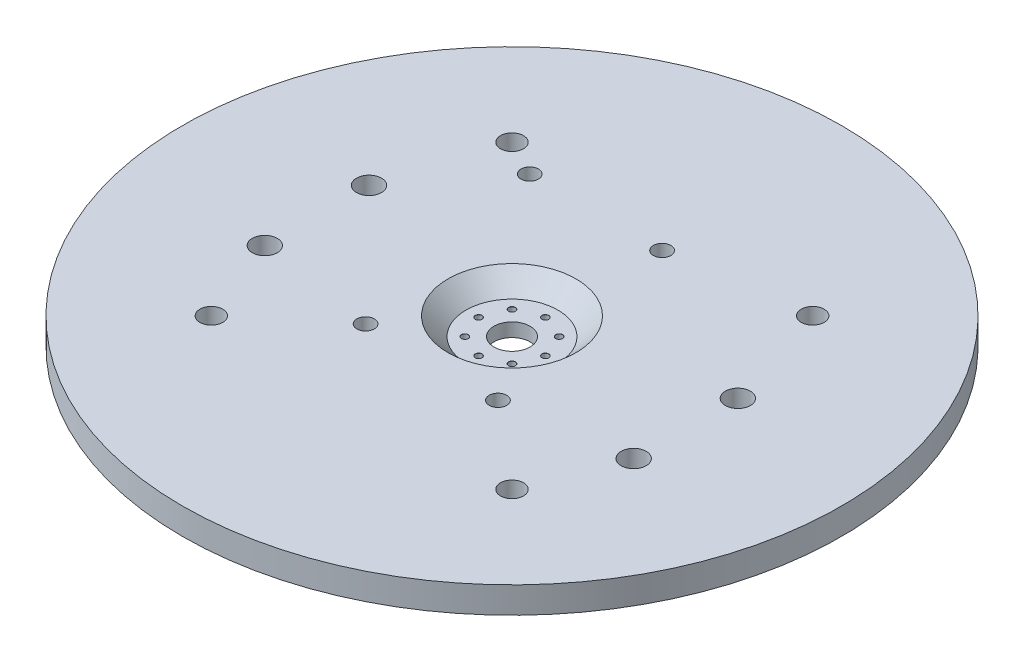
ISO-10303-21;
HEADER;
FILE_DESCRIPTION(('STEP AP214'),'2;1');
FILE_NAME('part.step','',(''),(''),'','','');
FILE_SCHEMA(('AUTOMOTIVE_DESIGN { 1 0 10303 214 1 1 1 1 }'));
ENDSEC;
DATA;
#1=APPLICATION_CONTEXT('core data for automotive mechanical design processes');
#2=APPLICATION_PROTOCOL_DEFINITION('international standard','automotive_design',2000,#1);
#3=PRODUCT_CONTEXT('',#1,'mechanical');
#4=PRODUCT('Part','Part','',(#3));
#5=PRODUCT_RELATED_PRODUCT_CATEGORY('part','',(#4));
#6=PRODUCT_DEFINITION_FORMATION('','',#4);
#7=PRODUCT_DEFINITION_CONTEXT('part definition',#1,'design');
#8=PRODUCT_DEFINITION('design','',#6,#7);
#9=PRODUCT_DEFINITION_SHAPE('','',#8);
#10=(LENGTH_UNIT() NAMED_UNIT(*) SI_UNIT(.MILLI.,.METRE.));
#11=(NAMED_UNIT(*) PLANE_ANGLE_UNIT() SI_UNIT($,.RADIAN.));
#12=(NAMED_UNIT(*) SI_UNIT($,.STERADIAN.) SOLID_ANGLE_UNIT());
#13=UNCERTAINTY_MEASURE_WITH_UNIT(LENGTH_MEASURE(1.E-05),#10,'distance_accuracy_value','');
#14=(GEOMETRIC_REPRESENTATION_CONTEXT(3) GLOBAL_UNCERTAINTY_ASSIGNED_CONTEXT((#13)) GLOBAL_UNIT_ASSIGNED_CONTEXT((#10,
#11,#12)) REPRESENTATION_CONTEXT('',''));
#15=CARTESIAN_POINT('',(0.,0.,0.));
#16=DIRECTION('',(0.,0.,1.));
#17=DIRECTION('',(1.,0.,0.));
#18=AXIS2_PLACEMENT_3D('',#15,#16,#17);
#19=CARTESIAN_POINT('',(0.,-3.1623,0.));
#20=DIRECTION('',(0.,1.,0.));
#21=DIRECTION('',(0.,0.,1.));
#22=AXIS2_PLACEMENT_3D('',#19,#20,#21);
#23=PLANE('',#22);
#24=CARTESIAN_POINT('',(0.,-3.1623,0.));
#25=DIRECTION('',(0.,1.,0.));
#26=DIRECTION('',(0.,0.,1.));
#27=AXIS2_PLACEMENT_3D('',#24,#25,#26);
#28=CIRCLE('',#27,79.0575);
#29=CARTESIAN_POINT('',(0.,-3.1623,79.0575));
#30=VERTEX_POINT('',#29);
#31=EDGE_CURVE('E60',#30,#30,#28,.T.);
#32=ORIENTED_EDGE('',*,*,#31,.F.);
#33=EDGE_LOOP('',(#32));
#34=FACE_BOUND('',#33,.T.);
#35=CARTESIAN_POINT('',(15.875,-3.1623,19.2459107281112));
#36=DIRECTION('',(0.,1.,0.));
#37=DIRECTION('',(0.,0.,1.));
#38=AXIS2_PLACEMENT_3D('',#35,#36,#37);
#39=CIRCLE('',#38,2.1);
#40=CARTESIAN_POINT('',(15.875,-3.1623,21.3459107281112));
#41=VERTEX_POINT('',#40);
#42=EDGE_CURVE('E63',#41,#41,#39,.T.);
#43=ORIENTED_EDGE('',*,*,#42,.T.);
#44=EDGE_LOOP('',(#43));
#45=FACE_BOUND('',#44,.T.);
#46=CARTESIAN_POINT('',(-15.875,-3.1623,19.2459107281112));
#47=DIRECTION('',(0.,1.,0.));
#48=DIRECTION('',(0.,0.,1.));
#49=AXIS2_PLACEMENT_3D('',#46,#47,#48);
#50=CIRCLE('',#49,2.1);
#51=CARTESIAN_POINT('',(-15.875,-3.1623,21.3459107281112));
#52=VERTEX_POINT('',#51);
#53=EDGE_CURVE('E71',#52,#52,#50,.T.);
#54=ORIENTED_EDGE('',*,*,#53,.T.);
#55=EDGE_LOOP('',(#54));
#56=FACE_BOUND('',#55,.T.);
#57=CARTESIAN_POINT('',(4.4311914,-3.1623,-31.5711836718892));
#58=DIRECTION('',(0.,1.,0.));
#59=DIRECTION('',(0.,0.,1.));
#60=AXIS2_PLACEMENT_3D('',#57,#58,#59);
#61=CIRCLE('',#60,2.1);
#62=CARTESIAN_POINT('',(4.4311914,-3.1623,-29.4711836718892));
#63=VERTEX_POINT('',#62);
#64=EDGE_CURVE('E77',#63,#63,#61,.T.);
#65=ORIENTED_EDGE('',*,*,#64,.T.);
#66=EDGE_LOOP('',(#65));
#67=FACE_BOUND('',#66,.T.);
#68=CARTESIAN_POINT('',(-27.3188086,-3.1623,-31.5711836718892));
#69=DIRECTION('',(0.,1.,0.));
#70=DIRECTION('',(0.,0.,1.));
#71=AXIS2_PLACEMENT_3D('',#68,#69,#70);
#72=CIRCLE('',#71,2.1);
#73=CARTESIAN_POINT('',(-27.3188086,-3.1623,-29.4711836718892));
#74=VERTEX_POINT('',#73);
#75=EDGE_CURVE('E83',#74,#74,#72,.T.);
#76=ORIENTED_EDGE('',*,*,#75,.T.);
#77=EDGE_LOOP('',(#76));
#78=FACE_BOUND('',#77,.T.);
#79=CARTESIAN_POINT('',(44.245,-3.1623,15.0584163281112));
#80=DIRECTION('',(0.,1.,0.));
#81=DIRECTION('',(0.,0.,1.));
#82=AXIS2_PLACEMENT_3D('',#79,#80,#81);
#83=CIRCLE('',#82,3.);
#84=CARTESIAN_POINT('',(44.245,-3.1623,18.0584163281112));
#85=VERTEX_POINT('',#84);
#86=EDGE_CURVE('E89',#85,#85,#83,.T.);
#87=ORIENTED_EDGE('',*,*,#86,.T.);
#88=EDGE_LOOP('',(#87));
#89=FACE_BOUND('',#88,.T.);
#90=CARTESIAN_POINT('',(44.245,-3.1623,-9.94158367188884));
#91=DIRECTION('',(0.,1.,0.));
#92=DIRECTION('',(0.,0.,1.));
#93=AXIS2_PLACEMENT_3D('',#90,#91,#92);
#94=CIRCLE('',#93,3.);
#95=CARTESIAN_POINT('',(44.245,-3.1623,-6.94158367188884));
#96=VERTEX_POINT('',#95);
#97=EDGE_CURVE('E95',#96,#96,#94,.T.);
#98=ORIENTED_EDGE('',*,*,#97,.T.);
#99=EDGE_LOOP('',(#98));
#100=FACE_BOUND('',#99,.T.);
#101=CARTESIAN_POINT('',(-44.245,-3.1623,15.0584163281112));
#102=DIRECTION('',(0.,1.,0.));
#103=DIRECTION('',(0.,0.,1.));
#104=AXIS2_PLACEMENT_3D('',#101,#102,#103);
#105=CIRCLE('',#104,3.);
#106=CARTESIAN_POINT('',(-44.245,-3.1623,18.0584163281112));
#107=VERTEX_POINT('',#106);
#108=EDGE_CURVE('E101',#107,#107,#105,.T.);
#109=ORIENTED_EDGE('',*,*,#108,.T.);
#110=EDGE_LOOP('',(#109));
#111=FACE_BOUND('',#110,.T.);
#112=CARTESIAN_POINT('',(-44.245,-3.1623,-9.94158367188883));
#113=DIRECTION('',(0.,1.,0.));
#114=DIRECTION('',(0.,0.,1.));
#115=AXIS2_PLACEMENT_3D('',#112,#113,#114);
#116=CIRCLE('',#115,3.);
#117=CARTESIAN_POINT('',(-44.245,-3.1623,-6.94158367188883));
#118=VERTEX_POINT('',#117);
#119=EDGE_CURVE('E107',#118,#118,#116,.T.);
#120=ORIENTED_EDGE('',*,*,#119,.T.);
#121=EDGE_LOOP('',(#120));
#122=FACE_BOUND('',#121,.T.);
#123=CARTESIAN_POINT('',(36.0624458405139,-3.1623,-36.0624458405139));
#124=DIRECTION('',(0.,1.,0.));
#125=DIRECTION('',(0.,0.,1.));
#126=AXIS2_PLACEMENT_3D('',#123,#124,#125);
#127=CIRCLE('',#126,2.75);
#128=CARTESIAN_POINT('',(36.0624458405139,-3.1623,-33.3124458405139));
#129=VERTEX_POINT('',#128);
#130=EDGE_CURVE('E113',#129,#129,#127,.T.);
#131=ORIENTED_EDGE('',*,*,#130,.T.);
#132=EDGE_LOOP('',(#131));
#133=FACE_BOUND('',#132,.T.);
#134=CARTESIAN_POINT('',(36.0624458405139,-3.1623,36.0624458405139));
#135=DIRECTION('',(0.,1.,0.));
#136=DIRECTION('',(0.,0.,1.));
#137=AXIS2_PLACEMENT_3D('',#134,#135,#136);
#138=CIRCLE('',#137,2.75);
#139=CARTESIAN_POINT('',(36.0624458405139,-3.1623,38.8124458405139));
#140=VERTEX_POINT('',#139);
#141=EDGE_CURVE('E119',#140,#140,#138,.T.);
#142=ORIENTED_EDGE('',*,*,#141,.T.);
#143=EDGE_LOOP('',(#142));
#144=FACE_BOUND('',#143,.T.);
#145=CARTESIAN_POINT('',(-36.0624458405139,-3.1623,36.0624458405139));
#146=DIRECTION('',(0.,1.,0.));
#147=DIRECTION('',(0.,0.,1.));
#148=AXIS2_PLACEMENT_3D('',#145,#146,#147);
#149=CIRCLE('',#148,2.75);
#150=CARTESIAN_POINT('',(-36.0624458405139,-3.1623,38.8124458405139));
#151=VERTEX_POINT('',#150);
#152=EDGE_CURVE('E125',#151,#151,#149,.T.);
#153=ORIENTED_EDGE('',*,*,#152,.T.);
#154=EDGE_LOOP('',(#153));
#155=FACE_BOUND('',#154,.T.);
#156=CARTESIAN_POINT('',(-36.0624458405139,-3.1623,-36.0624458405139));
#157=DIRECTION('',(0.,1.,0.));
#158=DIRECTION('',(0.,0.,1.));
#159=AXIS2_PLACEMENT_3D('',#156,#157,#158);
#160=CIRCLE('',#159,2.75);
#161=CARTESIAN_POINT('',(-36.0624458405139,-3.1623,-33.3124458405139));
#162=VERTEX_POINT('',#161);
#163=EDGE_CURVE('E131',#162,#162,#160,.T.);
#164=ORIENTED_EDGE('',*,*,#163,.T.);
#165=EDGE_LOOP('',(#164));
#166=FACE_BOUND('',#165,.T.);
#167=CARTESIAN_POINT('',(0.,-3.1623,0.));
#168=DIRECTION('',(0.,1.,0.));
#169=DIRECTION('',(0.,0.,1.));
#170=AXIS2_PLACEMENT_3D('',#167,#168,#169);
#171=CIRCLE('',#170,11.);
#172=CARTESIAN_POINT('',(0.,-3.1623,11.));
#173=VERTEX_POINT('',#172);
#174=EDGE_CURVE('E11',#173,#173,#171,.F.);
#175=ORIENTED_EDGE('',*,*,#174,.F.);
#176=EDGE_LOOP('',(#175));
#177=FACE_BOUND('',#176,.T.);
#178=ADVANCED_FACE('F41',(#34,#45,#56,#67,#78,#89,#100,#111,#122,#133,#144,#155,#166,#177),#23,.F.);
#179=CARTESIAN_POINT('',(0.,-3.1623,0.));
#180=DIRECTION('',(0.,1.,0.));
#181=DIRECTION('',(0.,0.,1.));
#182=AXIS2_PLACEMENT_3D('',#179,#180,#181);
#183=CYLINDRICAL_SURFACE('',#182,4.330200001);
#184=CARTESIAN_POINT('',(0.,-1.1623,0.));
#185=DIRECTION('',(0.,1.,0.));
#186=DIRECTION('',(0.,0.,1.));
#187=AXIS2_PLACEMENT_3D('',#184,#185,#186);
#188=CIRCLE('',#187,4.330200001);
#189=CARTESIAN_POINT('',(0.,-1.1623,4.330200001));
#190=VERTEX_POINT('',#189);
#191=EDGE_CURVE('E137',#190,#190,#188,.F.);
#192=ORIENTED_EDGE('',*,*,#191,.F.);
#193=EDGE_LOOP('',(#192));
#194=FACE_BOUND('',#193,.T.);
#195=CARTESIAN_POINT('',(0.,-4.4323,0.));
#196=DIRECTION('',(0.,-1.,0.));
#197=DIRECTION('',(0.,0.,-1.));
#198=AXIS2_PLACEMENT_3D('',#195,#196,#197);
#199=CIRCLE('',#198,4.330200001);
#200=CARTESIAN_POINT('',(0.,-4.4323,-4.330200001));
#201=VERTEX_POINT('',#200);
#202=EDGE_CURVE('E215',#201,#201,#199,.T.);
#203=ORIENTED_EDGE('',*,*,#202,.T.);
#204=EDGE_LOOP('',(#203));
#205=FACE_BOUND('',#204,.T.);
#206=ADVANCED_FACE('F219',(#194,#205),#183,.F.);
#207=CARTESIAN_POINT('',(0.,3.1623,0.));
#208=DIRECTION('',(0.,-1.,0.));
#209=DIRECTION('',(0.,0.,-1.));
#210=AXIS2_PLACEMENT_3D('',#207,#208,#209);
#211=CYLINDRICAL_SURFACE('',#210,79.0575);
#212=CARTESIAN_POINT('',(0.,3.1623,0.));
#213=DIRECTION('',(0.,1.,0.));
#214=DIRECTION('',(0.,0.,1.));
#215=AXIS2_PLACEMENT_3D('',#212,#213,#214);
#216=CIRCLE('',#215,79.0575);
#217=CARTESIAN_POINT('',(0.,3.1623,79.0575));
#218=VERTEX_POINT('',#217);
#219=EDGE_CURVE('E57',#218,#218,#216,.T.);
#220=ORIENTED_EDGE('',*,*,#219,.F.);
#221=EDGE_LOOP('',(#220));
#222=FACE_BOUND('',#221,.T.);
#223=ORIENTED_EDGE('',*,*,#31,.T.);
#224=EDGE_LOOP('',(#223));
#225=FACE_BOUND('',#224,.T.);
#226=ADVANCED_FACE('F244',(#222,#225),#211,.T.);
#227=CARTESIAN_POINT('',(0.,3.1623,0.));
#228=DIRECTION('',(0.,1.,0.));
#229=DIRECTION('',(0.,0.,1.));
#230=AXIS2_PLACEMENT_3D('',#227,#228,#229);
#231=PLANE('',#230);
#232=CARTESIAN_POINT('',(0.,3.1623,0.));
#233=DIRECTION('',(0.,1.,0.));
#234=DIRECTION('',(0.,0.,1.));
#235=AXIS2_PLACEMENT_3D('',#232,#233,#234);
#236=CIRCLE('',#235,15.35);
#237=CARTESIAN_POINT('',(0.,3.1623,15.35));
#238=VERTEX_POINT('',#237);
#239=EDGE_CURVE('E53',#238,#238,#236,.F.);
#240=ORIENTED_EDGE('',*,*,#239,.T.);
#241=EDGE_LOOP('',(#240));
#242=FACE_BOUND('',#241,.T.);
#243=CARTESIAN_POINT('',(-36.0624458405139,3.1623,-36.0624458405139));
#244=DIRECTION('',(0.,1.,0.));
#245=DIRECTION('',(0.,0.,1.));
#246=AXIS2_PLACEMENT_3D('',#243,#244,#245);
#247=CIRCLE('',#246,2.75);
#248=CARTESIAN_POINT('',(-36.0624458405139,3.1623,-33.3124458405139));
#249=VERTEX_POINT('',#248);
#250=EDGE_CURVE('E134',#249,#249,#247,.T.);
#251=ORIENTED_EDGE('',*,*,#250,.F.);
#252=EDGE_LOOP('',(#251));
#253=FACE_BOUND('',#252,.T.);
#254=CARTESIAN_POINT('',(-36.0624458405139,3.1623,36.0624458405139));
#255=DIRECTION('',(0.,1.,0.));
#256=DIRECTION('',(0.,0.,1.));
#257=AXIS2_PLACEMENT_3D('',#254,#255,#256);
#258=CIRCLE('',#257,2.75);
#259=CARTESIAN_POINT('',(-36.0624458405139,3.1623,38.8124458405139));
#260=VERTEX_POINT('',#259);
#261=EDGE_CURVE('E128',#260,#260,#258,.T.);
#262=ORIENTED_EDGE('',*,*,#261,.F.);
#263=EDGE_LOOP('',(#262));
#264=FACE_BOUND('',#263,.T.);
#265=CARTESIAN_POINT('',(36.0624458405139,3.1623,36.0624458405139));
#266=DIRECTION('',(0.,1.,0.));
#267=DIRECTION('',(0.,0.,1.));
#268=AXIS2_PLACEMENT_3D('',#265,#266,#267);
#269=CIRCLE('',#268,2.75);
#270=CARTESIAN_POINT('',(36.0624458405139,3.1623,38.8124458405139));
#271=VERTEX_POINT('',#270);
#272=EDGE_CURVE('E122',#271,#271,#269,.T.);
#273=ORIENTED_EDGE('',*,*,#272,.F.);
#274=EDGE_LOOP('',(#273));
#275=FACE_BOUND('',#274,.T.);
#276=CARTESIAN_POINT('',(36.0624458405139,3.1623,-36.0624458405139));
#277=DIRECTION('',(0.,1.,0.));
#278=DIRECTION('',(0.,0.,1.));
#279=AXIS2_PLACEMENT_3D('',#276,#277,#278);
#280=CIRCLE('',#279,2.75);
#281=CARTESIAN_POINT('',(36.0624458405139,3.1623,-33.3124458405139));
#282=VERTEX_POINT('',#281);
#283=EDGE_CURVE('E116',#282,#282,#280,.T.);
#284=ORIENTED_EDGE('',*,*,#283,.F.);
#285=EDGE_LOOP('',(#284));
#286=FACE_BOUND('',#285,.T.);
#287=CARTESIAN_POINT('',(-44.245,3.1623,-9.94158367188883));
#288=DIRECTION('',(0.,1.,0.));
#289=DIRECTION('',(0.,0.,1.));
#290=AXIS2_PLACEMENT_3D('',#287,#288,#289);
#291=CIRCLE('',#290,3.);
#292=CARTESIAN_POINT('',(-44.245,3.1623,-6.94158367188882));
#293=VERTEX_POINT('',#292);
#294=EDGE_CURVE('E110',#293,#293,#291,.T.);
#295=ORIENTED_EDGE('',*,*,#294,.F.);
#296=EDGE_LOOP('',(#295));
#297=FACE_BOUND('',#296,.T.);
#298=CARTESIAN_POINT('',(-44.245,3.1623,15.0584163281112));
#299=DIRECTION('',(0.,1.,0.));
#300=DIRECTION('',(0.,0.,1.));
#301=AXIS2_PLACEMENT_3D('',#298,#299,#300);
#302=CIRCLE('',#301,3.);
#303=CARTESIAN_POINT('',(-44.245,3.1623,18.0584163281112));
#304=VERTEX_POINT('',#303);
#305=EDGE_CURVE('E104',#304,#304,#302,.T.);
#306=ORIENTED_EDGE('',*,*,#305,.F.);
#307=EDGE_LOOP('',(#306));
#308=FACE_BOUND('',#307,.T.);
#309=CARTESIAN_POINT('',(44.245,3.1623,-9.94158367188884));
#310=DIRECTION('',(0.,1.,0.));
#311=DIRECTION('',(0.,0.,1.));
#312=AXIS2_PLACEMENT_3D('',#309,#310,#311);
#313=CIRCLE('',#312,3.);
#314=CARTESIAN_POINT('',(44.245,3.1623,-6.94158367188883));
#315=VERTEX_POINT('',#314);
#316=EDGE_CURVE('E98',#315,#315,#313,.T.);
#317=ORIENTED_EDGE('',*,*,#316,.F.);
#318=EDGE_LOOP('',(#317));
#319=FACE_BOUND('',#318,.T.);
#320=CARTESIAN_POINT('',(44.245,3.1623,15.0584163281112));
#321=DIRECTION('',(0.,1.,0.));
#322=DIRECTION('',(0.,0.,1.));
#323=AXIS2_PLACEMENT_3D('',#320,#321,#322);
#324=CIRCLE('',#323,3.);
#325=CARTESIAN_POINT('',(44.245,3.1623,18.0584163281112));
#326=VERTEX_POINT('',#325);
#327=EDGE_CURVE('E92',#326,#326,#324,.T.);
#328=ORIENTED_EDGE('',*,*,#327,.F.);
#329=EDGE_LOOP('',(#328));
#330=FACE_BOUND('',#329,.T.);
#331=CARTESIAN_POINT('',(-27.3188086,3.1623,-31.5711836718892));
#332=DIRECTION('',(0.,1.,0.));
#333=DIRECTION('',(0.,0.,1.));
#334=AXIS2_PLACEMENT_3D('',#331,#332,#333);
#335=CIRCLE('',#334,2.1);
#336=CARTESIAN_POINT('',(-27.3188086,3.1623,-29.4711836718892));
#337=VERTEX_POINT('',#336);
#338=EDGE_CURVE('E86',#337,#337,#335,.T.);
#339=ORIENTED_EDGE('',*,*,#338,.F.);
#340=EDGE_LOOP('',(#339));
#341=FACE_BOUND('',#340,.T.);
#342=CARTESIAN_POINT('',(4.4311914,3.1623,-31.5711836718892));
#343=DIRECTION('',(0.,1.,0.));
#344=DIRECTION('',(0.,0.,1.));
#345=AXIS2_PLACEMENT_3D('',#342,#343,#344);
#346=CIRCLE('',#345,2.1);
#347=CARTESIAN_POINT('',(4.4311914,3.1623,-29.4711836718892));
#348=VERTEX_POINT('',#347);
#349=EDGE_CURVE('E80',#348,#348,#346,.T.);
#350=ORIENTED_EDGE('',*,*,#349,.F.);
#351=EDGE_LOOP('',(#350));
#352=FACE_BOUND('',#351,.T.);
#353=CARTESIAN_POINT('',(-15.875,3.1623,19.2459107281112));
#354=DIRECTION('',(0.,1.,0.));
#355=DIRECTION('',(0.,0.,1.));
#356=AXIS2_PLACEMENT_3D('',#353,#354,#355);
#357=CIRCLE('',#356,2.1);
#358=CARTESIAN_POINT('',(-15.875,3.1623,21.3459107281112));
#359=VERTEX_POINT('',#358);
#360=EDGE_CURVE('E74',#359,#359,#357,.T.);
#361=ORIENTED_EDGE('',*,*,#360,.F.);
#362=EDGE_LOOP('',(#361));
#363=FACE_BOUND('',#362,.T.);
#364=CARTESIAN_POINT('',(15.875,3.1623,19.2459107281112));
#365=DIRECTION('',(0.,1.,0.));
#366=DIRECTION('',(0.,0.,1.));
#367=AXIS2_PLACEMENT_3D('',#364,#365,#366);
#368=CIRCLE('',#367,2.1);
#369=CARTESIAN_POINT('',(15.875,3.1623,21.3459107281112));
#370=VERTEX_POINT('',#369);
#371=EDGE_CURVE('E68',#370,#370,#368,.T.);
#372=ORIENTED_EDGE('',*,*,#371,.F.);
#373=EDGE_LOOP('',(#372));
#374=FACE_BOUND('',#373,.T.);
#375=ORIENTED_EDGE('',*,*,#219,.T.);
#376=EDGE_LOOP('',(#375));
#377=FACE_BOUND('',#376,.T.);
#378=ADVANCED_FACE('F250',(#242,#253,#264,#275,#286,#297,#308,#319,#330,#341,#352,#363,#374,
#377),#231,.T.);
#379=CARTESIAN_POINT('',(15.875,3.1623,19.2459107281112));
#380=DIRECTION('',(0.,1.,0.));
#381=DIRECTION('',(0.,0.,1.));
#382=AXIS2_PLACEMENT_3D('',#379,#380,#381);
#383=CYLINDRICAL_SURFACE('',#382,2.1);
#384=ORIENTED_EDGE('',*,*,#42,.F.);
#385=EDGE_LOOP('',(#384));
#386=FACE_BOUND('',#385,.T.);
#387=ORIENTED_EDGE('',*,*,#371,.T.);
#388=EDGE_LOOP('',(#387));
#389=FACE_BOUND('',#388,.T.);
#390=ADVANCED_FACE('F257',(#386,#389),#383,.F.);
#391=CARTESIAN_POINT('',(-15.875,3.1623,19.2459107281112));
#392=DIRECTION('',(0.,1.,0.));
#393=DIRECTION('',(0.,0.,1.));
#394=AXIS2_PLACEMENT_3D('',#391,#392,#393);
#395=CYLINDRICAL_SURFACE('',#394,2.1);
#396=ORIENTED_EDGE('',*,*,#53,.F.);
#397=EDGE_LOOP('',(#396));
#398=FACE_BOUND('',#397,.T.);
#399=ORIENTED_EDGE('',*,*,#360,.T.);
#400=EDGE_LOOP('',(#399));
#401=FACE_BOUND('',#400,.T.);
#402=ADVANCED_FACE('F265',(#398,#401),#395,.F.);
#403=CARTESIAN_POINT('',(4.4311914,3.1623,-31.5711836718892));
#404=DIRECTION('',(0.,1.,0.));
#405=DIRECTION('',(0.,0.,1.));
#406=AXIS2_PLACEMENT_3D('',#403,#404,#405);
#407=CYLINDRICAL_SURFACE('',#406,2.1);
#408=ORIENTED_EDGE('',*,*,#64,.F.);
#409=EDGE_LOOP('',(#408));
#410=FACE_BOUND('',#409,.T.);
#411=ORIENTED_EDGE('',*,*,#349,.T.);
#412=EDGE_LOOP('',(#411));
#413=FACE_BOUND('',#412,.T.);
#414=ADVANCED_FACE('F295',(#410,#413),#407,.F.);
#415=CARTESIAN_POINT('',(-27.3188086,3.1623,-31.5711836718892));
#416=DIRECTION('',(0.,1.,0.));
#417=DIRECTION('',(0.,0.,1.));
#418=AXIS2_PLACEMENT_3D('',#415,#416,#417);
#419=CYLINDRICAL_SURFACE('',#418,2.1);
#420=ORIENTED_EDGE('',*,*,#75,.F.);
#421=EDGE_LOOP('',(#420));
#422=FACE_BOUND('',#421,.T.);
#423=ORIENTED_EDGE('',*,*,#338,.T.);
#424=EDGE_LOOP('',(#423));
#425=FACE_BOUND('',#424,.T.);
#426=ADVANCED_FACE('F301',(#422,#425),#419,.F.);
#427=CARTESIAN_POINT('',(44.245,3.1623,15.0584163281112));
#428=DIRECTION('',(0.,1.,0.));
#429=DIRECTION('',(0.,0.,1.));
#430=AXIS2_PLACEMENT_3D('',#427,#428,#429);
#431=CYLINDRICAL_SURFACE('',#430,3.);
#432=ORIENTED_EDGE('',*,*,#86,.F.);
#433=EDGE_LOOP('',(#432));
#434=FACE_BOUND('',#433,.T.);
#435=ORIENTED_EDGE('',*,*,#327,.T.);
#436=EDGE_LOOP('',(#435));
#437=FACE_BOUND('',#436,.T.);
#438=ADVANCED_FACE('F308',(#434,#437),#431,.F.);
#439=CARTESIAN_POINT('',(44.245,3.1623,-9.94158367188884));
#440=DIRECTION('',(0.,1.,0.));
#441=DIRECTION('',(0.,0.,1.));
#442=AXIS2_PLACEMENT_3D('',#439,#440,#441);
#443=CYLINDRICAL_SURFACE('',#442,3.);
#444=ORIENTED_EDGE('',*,*,#97,.F.);
#445=EDGE_LOOP('',(#444));
#446=FACE_BOUND('',#445,.T.);
#447=ORIENTED_EDGE('',*,*,#316,.T.);
#448=EDGE_LOOP('',(#447));
#449=FACE_BOUND('',#448,.T.);
#450=ADVANCED_FACE('F312',(#446,#449),#443,.F.);
#451=CARTESIAN_POINT('',(-44.245,3.1623,15.0584163281112));
#452=DIRECTION('',(0.,1.,0.));
#453=DIRECTION('',(0.,0.,1.));
#454=AXIS2_PLACEMENT_3D('',#451,#452,#453);
#455=CYLINDRICAL_SURFACE('',#454,3.);
#456=ORIENTED_EDGE('',*,*,#108,.F.);
#457=EDGE_LOOP('',(#456));
#458=FACE_BOUND('',#457,.T.);
#459=ORIENTED_EDGE('',*,*,#305,.T.);
#460=EDGE_LOOP('',(#459));
#461=FACE_BOUND('',#460,.T.);
#462=ADVANCED_FACE('F316',(#458,#461),#455,.F.);
#463=CARTESIAN_POINT('',(-44.245,3.1623,-9.94158367188883));
#464=DIRECTION('',(0.,1.,0.));
#465=DIRECTION('',(0.,0.,1.));
#466=AXIS2_PLACEMENT_3D('',#463,#464,#465);
#467=CYLINDRICAL_SURFACE('',#466,3.);
#468=ORIENTED_EDGE('',*,*,#119,.F.);
#469=EDGE_LOOP('',(#468));
#470=FACE_BOUND('',#469,.T.);
#471=ORIENTED_EDGE('',*,*,#294,.T.);
#472=EDGE_LOOP('',(#471));
#473=FACE_BOUND('',#472,.T.);
#474=ADVANCED_FACE('F320',(#470,#473),#467,.F.);
#475=CARTESIAN_POINT('',(36.0624458405139,3.1623,-36.0624458405139));
#476=DIRECTION('',(0.,1.,0.));
#477=DIRECTION('',(0.,0.,1.));
#478=AXIS2_PLACEMENT_3D('',#475,#476,#477);
#479=CYLINDRICAL_SURFACE('',#478,2.75);
#480=ORIENTED_EDGE('',*,*,#130,.F.);
#481=EDGE_LOOP('',(#480));
#482=FACE_BOUND('',#481,.T.);
#483=ORIENTED_EDGE('',*,*,#283,.T.);
#484=EDGE_LOOP('',(#483));
#485=FACE_BOUND('',#484,.T.);
#486=ADVANCED_FACE('F324',(#482,#485),#479,.F.);
#487=CARTESIAN_POINT('',(36.0624458405139,3.1623,36.0624458405139));
#488=DIRECTION('',(0.,1.,0.));
#489=DIRECTION('',(0.,0.,1.));
#490=AXIS2_PLACEMENT_3D('',#487,#488,#489);
#491=CYLINDRICAL_SURFACE('',#490,2.75);
#492=ORIENTED_EDGE('',*,*,#141,.F.);
#493=EDGE_LOOP('',(#492));
#494=FACE_BOUND('',#493,.T.);
#495=ORIENTED_EDGE('',*,*,#272,.T.);
#496=EDGE_LOOP('',(#495));
#497=FACE_BOUND('',#496,.T.);
#498=ADVANCED_FACE('F328',(#494,#497),#491,.F.);
#499=CARTESIAN_POINT('',(-36.0624458405139,3.1623,36.0624458405139));
#500=DIRECTION('',(0.,1.,0.));
#501=DIRECTION('',(0.,0.,1.));
#502=AXIS2_PLACEMENT_3D('',#499,#500,#501);
#503=CYLINDRICAL_SURFACE('',#502,2.75);
#504=ORIENTED_EDGE('',*,*,#152,.F.);
#505=EDGE_LOOP('',(#504));
#506=FACE_BOUND('',#505,.T.);
#507=ORIENTED_EDGE('',*,*,#261,.T.);
#508=EDGE_LOOP('',(#507));
#509=FACE_BOUND('',#508,.T.);
#510=ADVANCED_FACE('F332',(#506,#509),#503,.F.);
#511=CARTESIAN_POINT('',(-36.0624458405139,3.1623,-36.0624458405139));
#512=DIRECTION('',(0.,1.,0.));
#513=DIRECTION('',(0.,0.,1.));
#514=AXIS2_PLACEMENT_3D('',#511,#512,#513);
#515=CYLINDRICAL_SURFACE('',#514,2.75);
#516=ORIENTED_EDGE('',*,*,#163,.F.);
#517=EDGE_LOOP('',(#516));
#518=FACE_BOUND('',#517,.T.);
#519=ORIENTED_EDGE('',*,*,#250,.T.);
#520=EDGE_LOOP('',(#519));
#521=FACE_BOUND('',#520,.T.);
#522=ADVANCED_FACE('F336',(#518,#521),#515,.F.);
#523=CARTESIAN_POINT('',(0.,-1.1623,0.));
#524=DIRECTION('',(0.,1.,0.));
#525=DIRECTION('',(0.,0.,1.));
#526=AXIS2_PLACEMENT_3D('',#523,#524,#525);
#527=PLANE('',#526);
#528=CARTESIAN_POINT('',(-8.,-1.1623,0.));
#529=DIRECTION('',(0.,1.,0.));
#530=DIRECTION('',(0.,0.,1.));
#531=AXIS2_PLACEMENT_3D('',#528,#529,#530);
#532=CIRCLE('',#531,0.824999999999999);
#533=CARTESIAN_POINT('',(-8.,-1.1623,0.825000000000001));
#534=VERTEX_POINT('',#533);
#535=EDGE_CURVE('E185',#534,#534,#532,.T.);
#536=ORIENTED_EDGE('',*,*,#535,.F.);
#537=EDGE_LOOP('',(#536));
#538=FACE_BOUND('',#537,.T.);
#539=CARTESIAN_POINT('',(-5.65685424949238,-1.1623,-5.65685424949238));
#540=DIRECTION('',(0.,1.,0.));
#541=DIRECTION('',(0.,0.,1.));
#542=AXIS2_PLACEMENT_3D('',#539,#540,#541);
#543=CIRCLE('',#542,0.824999999999999);
#544=CARTESIAN_POINT('',(-5.65685424949238,-1.1623,-4.83185424949238));
#545=VERTEX_POINT('',#544);
#546=EDGE_CURVE('E179',#545,#545,#543,.T.);
#547=ORIENTED_EDGE('',*,*,#546,.F.);
#548=EDGE_LOOP('',(#547));
#549=FACE_BOUND('',#548,.T.);
#550=CARTESIAN_POINT('',(0.,-1.1623,-8.));
#551=DIRECTION('',(0.,1.,0.));
#552=DIRECTION('',(0.,0.,1.));
#553=AXIS2_PLACEMENT_3D('',#550,#551,#552);
#554=CIRCLE('',#553,0.824999999999999);
#555=CARTESIAN_POINT('',(0.,-1.1623,-7.175));
#556=VERTEX_POINT('',#555);
#557=EDGE_CURVE('E173',#556,#556,#554,.T.);
#558=ORIENTED_EDGE('',*,*,#557,.F.);
#559=EDGE_LOOP('',(#558));
#560=FACE_BOUND('',#559,.T.);
#561=CARTESIAN_POINT('',(5.65685424949238,-1.1623,-5.65685424949238));
#562=DIRECTION('',(0.,1.,0.));
#563=DIRECTION('',(0.,0.,1.));
#564=AXIS2_PLACEMENT_3D('',#561,#562,#563);
#565=CIRCLE('',#564,0.824999999999999);
#566=CARTESIAN_POINT('',(5.65685424949238,-1.1623,-4.83185424949238));
#567=VERTEX_POINT('',#566);
#568=EDGE_CURVE('E167',#567,#567,#565,.T.);
#569=ORIENTED_EDGE('',*,*,#568,.F.);
#570=EDGE_LOOP('',(#569));
#571=FACE_BOUND('',#570,.T.);
#572=CARTESIAN_POINT('',(8.,-1.1623,0.));
#573=DIRECTION('',(0.,1.,0.));
#574=DIRECTION('',(0.,0.,1.));
#575=AXIS2_PLACEMENT_3D('',#572,#573,#574);
#576=CIRCLE('',#575,0.824999999999999);
#577=CARTESIAN_POINT('',(8.,-1.1623,0.824999999999999));
#578=VERTEX_POINT('',#577);
#579=EDGE_CURVE('E161',#578,#578,#576,.T.);
#580=ORIENTED_EDGE('',*,*,#579,.F.);
#581=EDGE_LOOP('',(#580));
#582=FACE_BOUND('',#581,.T.);
#583=CARTESIAN_POINT('',(5.65685424949238,-1.1623,5.65685424949238));
#584=DIRECTION('',(0.,1.,0.));
#585=DIRECTION('',(0.,0.,1.));
#586=AXIS2_PLACEMENT_3D('',#583,#584,#585);
#587=CIRCLE('',#586,0.824999999999999);
#588=CARTESIAN_POINT('',(5.65685424949238,-1.1623,6.48185424949238));
#589=VERTEX_POINT('',#588);
#590=EDGE_CURVE('E155',#589,#589,#587,.T.);
#591=ORIENTED_EDGE('',*,*,#590,.F.);
#592=EDGE_LOOP('',(#591));
#593=FACE_BOUND('',#592,.T.);
#594=CARTESIAN_POINT('',(0.,-1.1623,8.));
#595=DIRECTION('',(0.,1.,0.));
#596=DIRECTION('',(0.,0.,1.));
#597=AXIS2_PLACEMENT_3D('',#594,#595,#596);
#598=CIRCLE('',#597,0.824999999999999);
#599=CARTESIAN_POINT('',(0.,-1.1623,8.825));
#600=VERTEX_POINT('',#599);
#601=EDGE_CURVE('E149',#600,#600,#598,.T.);
#602=ORIENTED_EDGE('',*,*,#601,.F.);
#603=EDGE_LOOP('',(#602));
#604=FACE_BOUND('',#603,.T.);
#605=CARTESIAN_POINT('',(-5.65685424949238,-1.1623,5.65685424949238));
#606=DIRECTION('',(0.,1.,0.));
#607=DIRECTION('',(0.,0.,1.));
#608=AXIS2_PLACEMENT_3D('',#605,#606,#607);
#609=CIRCLE('',#608,0.824999999999999);
#610=CARTESIAN_POINT('',(-5.65685424949238,-1.1623,6.48185424949238));
#611=VERTEX_POINT('',#610);
#612=EDGE_CURVE('E143',#611,#611,#609,.T.);
#613=ORIENTED_EDGE('',*,*,#612,.F.);
#614=EDGE_LOOP('',(#613));
#615=FACE_BOUND('',#614,.T.);
#616=CARTESIAN_POINT('',(0.,-1.1623,0.));
#617=DIRECTION('',(0.,1.,0.));
#618=DIRECTION('',(0.,0.,1.));
#619=AXIS2_PLACEMENT_3D('',#616,#617,#618);
#620=CIRCLE('',#619,11.0254000000001);
#621=CARTESIAN_POINT('',(0.,-1.1623,11.0254000000001));
#622=VERTEX_POINT('',#621);
#623=EDGE_CURVE('E49',#622,#622,#620,.T.);
#624=ORIENTED_EDGE('',*,*,#623,.T.);
#625=EDGE_LOOP('',(#624));
#626=FACE_BOUND('',#625,.T.);
#627=ORIENTED_EDGE('',*,*,#191,.T.);
#628=EDGE_LOOP('',(#627));
#629=FACE_BOUND('',#628,.T.);
#630=ADVANCED_FACE('F339',(#538,#549,#560,#571,#582,#593,#604,#615,#626,#629),#527,.T.);
#631=CARTESIAN_POINT('',(0.,-1.18770000000008,0.));
#632=DIRECTION('',(0.,1.,0.));
#633=DIRECTION('',(0.,0.,1.));
#634=AXIS2_PLACEMENT_3D('',#631,#632,#633);
#635=CONICAL_SURFACE('',#634,11.,0.785398163397443);
#636=ORIENTED_EDGE('',*,*,#239,.F.);
#637=EDGE_LOOP('',(#636));
#638=FACE_BOUND('',#637,.T.);
#639=ORIENTED_EDGE('',*,*,#623,.F.);
#640=EDGE_LOOP('',(#639));
#641=FACE_BOUND('',#640,.T.);
#642=ADVANCED_FACE('F44',(#638,#641),#635,.F.);
#643=CARTESIAN_POINT('',(-5.65685424949238,-1.1623,5.65685424949238));
#644=DIRECTION('',(0.,1.,0.));
#645=DIRECTION('',(0.,0.,1.));
#646=AXIS2_PLACEMENT_3D('',#643,#644,#645);
#647=CYLINDRICAL_SURFACE('',#646,0.799999999999997);
#648=CARTESIAN_POINT('',(-5.65685424949238,-1.1873,5.65685424949238));
#649=DIRECTION('',(0.,1.,0.));
#650=DIRECTION('',(0.,0.,1.));
#651=AXIS2_PLACEMENT_3D('',#648,#649,#650);
#652=CIRCLE('',#651,0.799999999999997);
#653=CARTESIAN_POINT('',(-5.65685424949238,-1.1873,6.45685424949238));
#654=VERTEX_POINT('',#653);
#655=EDGE_CURVE('E140',#654,#654,#652,.T.);
#656=ORIENTED_EDGE('',*,*,#655,.T.);
#657=EDGE_LOOP('',(#656));
#658=FACE_BOUND('',#657,.T.);
#659=CARTESIAN_POINT('',(-5.65685424949238,-4.4323,5.65685424949238));
#660=DIRECTION('',(0.,-1.,0.));
#661=DIRECTION('',(0.,0.,-1.));
#662=AXIS2_PLACEMENT_3D('',#659,#660,#661);
#663=CIRCLE('',#662,0.799999999999997);
#664=CARTESIAN_POINT('',(-5.65685424949238,-4.4323,4.85685424949238));
#665=VERTEX_POINT('',#664);
#666=EDGE_CURVE('E191',#665,#665,#663,.T.);
#667=ORIENTED_EDGE('',*,*,#666,.T.);
#668=EDGE_LOOP('',(#667));
#669=FACE_BOUND('',#668,.T.);
#670=ADVANCED_FACE('F345',(#658,#669),#647,.F.);
#671=CARTESIAN_POINT('',(-5.65685424949238,-1.1623,5.65685424949238));
#672=DIRECTION('',(0.,1.,0.));
#673=DIRECTION('',(0.,0.,1.));
#674=AXIS2_PLACEMENT_3D('',#671,#672,#673);
#675=CONICAL_SURFACE('',#674,0.824999999999999,0.785398163397518);
#676=ORIENTED_EDGE('',*,*,#655,.F.);
#677=EDGE_LOOP('',(#676));
#678=FACE_BOUND('',#677,.T.);
#679=ORIENTED_EDGE('',*,*,#612,.T.);
#680=EDGE_LOOP('',(#679));
#681=FACE_BOUND('',#680,.T.);
#682=ADVANCED_FACE('F348',(#678,#681),#675,.F.);
#683=CARTESIAN_POINT('',(0.,-1.1623,8.));
#684=DIRECTION('',(0.,1.,0.));
#685=DIRECTION('',(0.,0.,1.));
#686=AXIS2_PLACEMENT_3D('',#683,#684,#685);
#687=CYLINDRICAL_SURFACE('',#686,0.799999999999997);
#688=CARTESIAN_POINT('',(0.,-1.1873,8.));
#689=DIRECTION('',(0.,1.,0.));
#690=DIRECTION('',(0.,0.,1.));
#691=AXIS2_PLACEMENT_3D('',#688,#689,#690);
#692=CIRCLE('',#691,0.799999999999997);
#693=CARTESIAN_POINT('',(0.,-1.1873,8.8));
#694=VERTEX_POINT('',#693);
#695=EDGE_CURVE('E146',#694,#694,#692,.T.);
#696=ORIENTED_EDGE('',*,*,#695,.T.);
#697=EDGE_LOOP('',(#696));
#698=FACE_BOUND('',#697,.T.);
#699=CARTESIAN_POINT('',(0.,-4.4323,8.));
#700=DIRECTION('',(0.,-1.,0.));
#701=DIRECTION('',(0.,0.,-1.));
#702=AXIS2_PLACEMENT_3D('',#699,#700,#701);
#703=CIRCLE('',#702,0.799999999999997);
#704=CARTESIAN_POINT('',(0.,-4.4323,7.2));
#705=VERTEX_POINT('',#704);
#706=EDGE_CURVE('E212',#705,#705,#703,.T.);
#707=ORIENTED_EDGE('',*,*,#706,.T.);
#708=EDGE_LOOP('',(#707));
#709=FACE_BOUND('',#708,.T.);
#710=ADVANCED_FACE('F352',(#698,#709),#687,.F.);
#711=CARTESIAN_POINT('',(0.,-1.1623,8.));
#712=DIRECTION('',(0.,1.,0.));
#713=DIRECTION('',(0.,0.,1.));
#714=AXIS2_PLACEMENT_3D('',#711,#712,#713);
#715=CONICAL_SURFACE('',#714,0.824999999999999,0.785398163397511);
#716=ORIENTED_EDGE('',*,*,#695,.F.);
#717=EDGE_LOOP('',(#716));
#718=FACE_BOUND('',#717,.T.);
#719=ORIENTED_EDGE('',*,*,#601,.T.);
#720=EDGE_LOOP('',(#719));
#721=FACE_BOUND('',#720,.T.);
#722=ADVANCED_FACE('F356',(#718,#721),#715,.F.);
#723=CARTESIAN_POINT('',(5.65685424949238,-1.1623,5.65685424949238));
#724=DIRECTION('',(0.,1.,0.));
#725=DIRECTION('',(0.,0.,1.));
#726=AXIS2_PLACEMENT_3D('',#723,#724,#725);
#727=CYLINDRICAL_SURFACE('',#726,0.799999999999997);
#728=CARTESIAN_POINT('',(5.65685424949238,-1.1873,5.65685424949238));
#729=DIRECTION('',(0.,1.,0.));
#730=DIRECTION('',(0.,0.,1.));
#731=AXIS2_PLACEMENT_3D('',#728,#729,#730);
#732=CIRCLE('',#731,0.799999999999997);
#733=CARTESIAN_POINT('',(5.65685424949238,-1.1873,6.45685424949238));
#734=VERTEX_POINT('',#733);
#735=EDGE_CURVE('E152',#734,#734,#732,.T.);
#736=ORIENTED_EDGE('',*,*,#735,.T.);
#737=EDGE_LOOP('',(#736));
#738=FACE_BOUND('',#737,.T.);
#739=CARTESIAN_POINT('',(5.65685424949238,-4.4323,5.65685424949238));
#740=DIRECTION('',(0.,-1.,0.));
#741=DIRECTION('',(0.,0.,-1.));
#742=AXIS2_PLACEMENT_3D('',#739,#740,#741);
#743=CIRCLE('',#742,0.799999999999997);
#744=CARTESIAN_POINT('',(5.65685424949238,-4.4323,4.85685424949238));
#745=VERTEX_POINT('',#744);
#746=EDGE_CURVE('E209',#745,#745,#743,.T.);
#747=ORIENTED_EDGE('',*,*,#746,.T.);
#748=EDGE_LOOP('',(#747));
#749=FACE_BOUND('',#748,.T.);
#750=ADVANCED_FACE('F360',(#738,#749),#727,.F.);
#751=CARTESIAN_POINT('',(5.65685424949238,-1.1623,5.65685424949238));
#752=DIRECTION('',(0.,1.,0.));
#753=DIRECTION('',(0.,0.,1.));
#754=AXIS2_PLACEMENT_3D('',#751,#752,#753);
#755=CONICAL_SURFACE('',#754,0.824999999999999,0.785398163397518);
#756=ORIENTED_EDGE('',*,*,#735,.F.);
#757=EDGE_LOOP('',(#756));
#758=FACE_BOUND('',#757,.T.);
#759=ORIENTED_EDGE('',*,*,#590,.T.);
#760=EDGE_LOOP('',(#759));
#761=FACE_BOUND('',#760,.T.);
#762=ADVANCED_FACE('F364',(#758,#761),#755,.F.);
#763=CARTESIAN_POINT('',(8.,-1.1623,0.));
#764=DIRECTION('',(0.,1.,0.));
#765=DIRECTION('',(0.,0.,1.));
#766=AXIS2_PLACEMENT_3D('',#763,#764,#765);
#767=CYLINDRICAL_SURFACE('',#766,0.799999999999997);
#768=CARTESIAN_POINT('',(8.,-1.1873,0.));
#769=DIRECTION('',(0.,1.,0.));
#770=DIRECTION('',(0.,0.,1.));
#771=AXIS2_PLACEMENT_3D('',#768,#769,#770);
#772=CIRCLE('',#771,0.799999999999997);
#773=CARTESIAN_POINT('',(8.,-1.1873,0.799999999999997));
#774=VERTEX_POINT('',#773);
#775=EDGE_CURVE('E158',#774,#774,#772,.T.);
#776=ORIENTED_EDGE('',*,*,#775,.T.);
#777=EDGE_LOOP('',(#776));
#778=FACE_BOUND('',#777,.T.);
#779=CARTESIAN_POINT('',(8.,-4.4323,0.));
#780=DIRECTION('',(0.,-1.,0.));
#781=DIRECTION('',(0.,0.,-1.));
#782=AXIS2_PLACEMENT_3D('',#779,#780,#781);
#783=CIRCLE('',#782,0.799999999999997);
#784=CARTESIAN_POINT('',(8.,-4.4323,-0.799999999999997));
#785=VERTEX_POINT('',#784);
#786=EDGE_CURVE('E206',#785,#785,#783,.T.);
#787=ORIENTED_EDGE('',*,*,#786,.T.);
#788=EDGE_LOOP('',(#787));
#789=FACE_BOUND('',#788,.T.);
#790=ADVANCED_FACE('F368',(#778,#789),#767,.F.);
#791=CARTESIAN_POINT('',(8.,-1.1623,0.));
#792=DIRECTION('',(0.,1.,0.));
#793=DIRECTION('',(0.,0.,1.));
#794=AXIS2_PLACEMENT_3D('',#791,#792,#793);
#795=CONICAL_SURFACE('',#794,0.824999999999999,0.785398163397518);
#796=ORIENTED_EDGE('',*,*,#775,.F.);
#797=EDGE_LOOP('',(#796));
#798=FACE_BOUND('',#797,.T.);
#799=ORIENTED_EDGE('',*,*,#579,.T.);
#800=EDGE_LOOP('',(#799));
#801=FACE_BOUND('',#800,.T.);
#802=ADVANCED_FACE('F372',(#798,#801),#795,.F.);
#803=CARTESIAN_POINT('',(5.65685424949238,-1.1623,-5.65685424949238));
#804=DIRECTION('',(0.,1.,0.));
#805=DIRECTION('',(0.,0.,1.));
#806=AXIS2_PLACEMENT_3D('',#803,#804,#805);
#807=CYLINDRICAL_SURFACE('',#806,0.799999999999997);
#808=CARTESIAN_POINT('',(5.65685424949238,-1.1873,-5.65685424949238));
#809=DIRECTION('',(0.,1.,0.));
#810=DIRECTION('',(0.,0.,1.));
#811=AXIS2_PLACEMENT_3D('',#808,#809,#810);
#812=CIRCLE('',#811,0.799999999999997);
#813=CARTESIAN_POINT('',(5.65685424949238,-1.1873,-4.85685424949239));
#814=VERTEX_POINT('',#813);
#815=EDGE_CURVE('E164',#814,#814,#812,.T.);
#816=ORIENTED_EDGE('',*,*,#815,.T.);
#817=EDGE_LOOP('',(#816));
#818=FACE_BOUND('',#817,.T.);
#819=CARTESIAN_POINT('',(5.65685424949238,-4.4323,-5.65685424949238));
#820=DIRECTION('',(0.,-1.,0.));
#821=DIRECTION('',(0.,0.,-1.));
#822=AXIS2_PLACEMENT_3D('',#819,#820,#821);
#823=CIRCLE('',#822,0.799999999999997);
#824=CARTESIAN_POINT('',(5.65685424949238,-4.4323,-6.45685424949238));
#825=VERTEX_POINT('',#824);
#826=EDGE_CURVE('E203',#825,#825,#823,.T.);
#827=ORIENTED_EDGE('',*,*,#826,.T.);
#828=EDGE_LOOP('',(#827));
#829=FACE_BOUND('',#828,.T.);
#830=ADVANCED_FACE('F376',(#818,#829),#807,.F.);
#831=CARTESIAN_POINT('',(5.65685424949238,-1.1623,-5.65685424949238));
#832=DIRECTION('',(0.,1.,0.));
#833=DIRECTION('',(0.,0.,1.));
#834=AXIS2_PLACEMENT_3D('',#831,#832,#833);
#835=CONICAL_SURFACE('',#834,0.824999999999999,0.785398163397518);
#836=ORIENTED_EDGE('',*,*,#815,.F.);
#837=EDGE_LOOP('',(#836));
#838=FACE_BOUND('',#837,.T.);
#839=ORIENTED_EDGE('',*,*,#568,.T.);
#840=EDGE_LOOP('',(#839));
#841=FACE_BOUND('',#840,.T.);
#842=ADVANCED_FACE('F380',(#838,#841),#835,.F.);
#843=CARTESIAN_POINT('',(0.,-1.1623,-8.));
#844=DIRECTION('',(0.,1.,0.));
#845=DIRECTION('',(0.,0.,1.));
#846=AXIS2_PLACEMENT_3D('',#843,#844,#845);
#847=CYLINDRICAL_SURFACE('',#846,0.799999999999997);
#848=CARTESIAN_POINT('',(0.,-1.1873,-8.));
#849=DIRECTION('',(0.,1.,0.));
#850=DIRECTION('',(0.,0.,1.));
#851=AXIS2_PLACEMENT_3D('',#848,#849,#850);
#852=CIRCLE('',#851,0.799999999999997);
#853=CARTESIAN_POINT('',(0.,-1.1873,-7.2));
#854=VERTEX_POINT('',#853);
#855=EDGE_CURVE('E170',#854,#854,#852,.T.);
#856=ORIENTED_EDGE('',*,*,#855,.T.);
#857=EDGE_LOOP('',(#856));
#858=FACE_BOUND('',#857,.T.);
#859=CARTESIAN_POINT('',(0.,-4.4323,-8.));
#860=DIRECTION('',(0.,-1.,0.));
#861=DIRECTION('',(0.,0.,-1.));
#862=AXIS2_PLACEMENT_3D('',#859,#860,#861);
#863=CIRCLE('',#862,0.799999999999997);
#864=CARTESIAN_POINT('',(0.,-4.4323,-8.8));
#865=VERTEX_POINT('',#864);
#866=EDGE_CURVE('E200',#865,#865,#863,.T.);
#867=ORIENTED_EDGE('',*,*,#866,.T.);
#868=EDGE_LOOP('',(#867));
#869=FACE_BOUND('',#868,.T.);
#870=ADVANCED_FACE('F384',(#858,#869),#847,.F.);
#871=CARTESIAN_POINT('',(0.,-1.1623,-8.));
#872=DIRECTION('',(0.,1.,0.));
#873=DIRECTION('',(0.,0.,1.));
#874=AXIS2_PLACEMENT_3D('',#871,#872,#873);
#875=CONICAL_SURFACE('',#874,0.824999999999999,0.785398163397511);
#876=ORIENTED_EDGE('',*,*,#855,.F.);
#877=EDGE_LOOP('',(#876));
#878=FACE_BOUND('',#877,.T.);
#879=ORIENTED_EDGE('',*,*,#557,.T.);
#880=EDGE_LOOP('',(#879));
#881=FACE_BOUND('',#880,.T.);
#882=ADVANCED_FACE('F388',(#878,#881),#875,.F.);
#883=CARTESIAN_POINT('',(-5.65685424949238,-1.1623,-5.65685424949238));
#884=DIRECTION('',(0.,1.,0.));
#885=DIRECTION('',(0.,0.,1.));
#886=AXIS2_PLACEMENT_3D('',#883,#884,#885);
#887=CYLINDRICAL_SURFACE('',#886,0.799999999999997);
#888=CARTESIAN_POINT('',(-5.65685424949238,-1.1873,-5.65685424949238));
#889=DIRECTION('',(0.,1.,0.));
#890=DIRECTION('',(0.,0.,1.));
#891=AXIS2_PLACEMENT_3D('',#888,#889,#890);
#892=CIRCLE('',#891,0.799999999999997);
#893=CARTESIAN_POINT('',(-5.65685424949238,-1.1873,-4.85685424949238));
#894=VERTEX_POINT('',#893);
#895=EDGE_CURVE('E176',#894,#894,#892,.T.);
#896=ORIENTED_EDGE('',*,*,#895,.T.);
#897=EDGE_LOOP('',(#896));
#898=FACE_BOUND('',#897,.T.);
#899=CARTESIAN_POINT('',(-5.65685424949238,-4.4323,-5.65685424949238));
#900=DIRECTION('',(0.,-1.,0.));
#901=DIRECTION('',(0.,0.,-1.));
#902=AXIS2_PLACEMENT_3D('',#899,#900,#901);
#903=CIRCLE('',#902,0.799999999999997);
#904=CARTESIAN_POINT('',(-5.65685424949238,-4.4323,-6.45685424949238));
#905=VERTEX_POINT('',#904);
#906=EDGE_CURVE('E197',#905,#905,#903,.T.);
#907=ORIENTED_EDGE('',*,*,#906,.T.);
#908=EDGE_LOOP('',(#907));
#909=FACE_BOUND('',#908,.T.);
#910=ADVANCED_FACE('F392',(#898,#909),#887,.F.);
#911=CARTESIAN_POINT('',(-5.65685424949238,-1.1623,-5.65685424949238));
#912=DIRECTION('',(0.,1.,0.));
#913=DIRECTION('',(0.,0.,1.));
#914=AXIS2_PLACEMENT_3D('',#911,#912,#913);
#915=CONICAL_SURFACE('',#914,0.824999999999999,0.785398163397518);
#916=ORIENTED_EDGE('',*,*,#895,.F.);
#917=EDGE_LOOP('',(#916));
#918=FACE_BOUND('',#917,.T.);
#919=ORIENTED_EDGE('',*,*,#546,.T.);
#920=EDGE_LOOP('',(#919));
#921=FACE_BOUND('',#920,.T.);
#922=ADVANCED_FACE('F396',(#918,#921),#915,.F.);
#923=CARTESIAN_POINT('',(-8.,-1.1623,0.));
#924=DIRECTION('',(0.,1.,0.));
#925=DIRECTION('',(0.,0.,1.));
#926=AXIS2_PLACEMENT_3D('',#923,#924,#925);
#927=CYLINDRICAL_SURFACE('',#926,0.799999999999997);
#928=CARTESIAN_POINT('',(-8.,-1.1873,0.));
#929=DIRECTION('',(0.,1.,0.));
#930=DIRECTION('',(0.,0.,1.));
#931=AXIS2_PLACEMENT_3D('',#928,#929,#930);
#932=CIRCLE('',#931,0.799999999999997);
#933=CARTESIAN_POINT('',(-8.,-1.1873,0.799999999999999));
#934=VERTEX_POINT('',#933);
#935=EDGE_CURVE('E182',#934,#934,#932,.T.);
#936=ORIENTED_EDGE('',*,*,#935,.T.);
#937=EDGE_LOOP('',(#936));
#938=FACE_BOUND('',#937,.T.);
#939=CARTESIAN_POINT('',(-8.,-4.4323,0.));
#940=DIRECTION('',(0.,-1.,0.));
#941=DIRECTION('',(0.,0.,-1.));
#942=AXIS2_PLACEMENT_3D('',#939,#940,#941);
#943=CIRCLE('',#942,0.799999999999997);
#944=CARTESIAN_POINT('',(-8.,-4.4323,-0.799999999999995));
#945=VERTEX_POINT('',#944);
#946=EDGE_CURVE('E194',#945,#945,#943,.T.);
#947=ORIENTED_EDGE('',*,*,#946,.T.);
#948=EDGE_LOOP('',(#947));
#949=FACE_BOUND('',#948,.T.);
#950=ADVANCED_FACE('F233',(#938,#949),#927,.F.);
#951=CARTESIAN_POINT('',(-8.,-1.1623,0.));
#952=DIRECTION('',(0.,1.,0.));
#953=DIRECTION('',(0.,0.,1.));
#954=AXIS2_PLACEMENT_3D('',#951,#952,#953);
#955=CONICAL_SURFACE('',#954,0.824999999999999,0.785398163397518);
#956=ORIENTED_EDGE('',*,*,#935,.F.);
#957=EDGE_LOOP('',(#956));
#958=FACE_BOUND('',#957,.T.);
#959=ORIENTED_EDGE('',*,*,#535,.T.);
#960=EDGE_LOOP('',(#959));
#961=FACE_BOUND('',#960,.T.);
#962=ADVANCED_FACE('F224',(#958,#961),#955,.F.);
#963=CARTESIAN_POINT('',(0.,-4.4323,0.));
#964=DIRECTION('',(0.,-1.,0.));
#965=DIRECTION('',(0.,0.,-1.));
#966=AXIS2_PLACEMENT_3D('',#963,#964,#965);
#967=PLANE('',#966);
#968=ORIENTED_EDGE('',*,*,#706,.F.);
#969=EDGE_LOOP('',(#968));
#970=FACE_BOUND('',#969,.T.);
#971=ORIENTED_EDGE('',*,*,#786,.F.);
#972=EDGE_LOOP('',(#971));
#973=FACE_BOUND('',#972,.T.);
#974=ORIENTED_EDGE('',*,*,#866,.F.);
#975=EDGE_LOOP('',(#974));
#976=FACE_BOUND('',#975,.T.);
#977=ORIENTED_EDGE('',*,*,#946,.F.);
#978=EDGE_LOOP('',(#977));
#979=FACE_BOUND('',#978,.T.);
#980=CARTESIAN_POINT('',(0.,-4.4323,0.));
#981=DIRECTION('',(0.,-1.,0.));
#982=DIRECTION('',(0.,0.,-1.));
#983=AXIS2_PLACEMENT_3D('',#980,#981,#982);
#984=CIRCLE('',#983,11.);
#985=CARTESIAN_POINT('',(0.,-4.4323,-11.));
#986=VERTEX_POINT('',#985);
#987=EDGE_CURVE('E188',#986,#986,#984,.T.);
#988=ORIENTED_EDGE('',*,*,#987,.T.);
#989=EDGE_LOOP('',(#988));
#990=FACE_BOUND('',#989,.T.);
#991=ORIENTED_EDGE('',*,*,#666,.F.);
#992=EDGE_LOOP('',(#991));
#993=FACE_BOUND('',#992,.T.);
#994=ORIENTED_EDGE('',*,*,#906,.F.);
#995=EDGE_LOOP('',(#994));
#996=FACE_BOUND('',#995,.T.);
#997=ORIENTED_EDGE('',*,*,#826,.F.);
#998=EDGE_LOOP('',(#997));
#999=FACE_BOUND('',#998,.T.);
#1000=ORIENTED_EDGE('',*,*,#746,.F.);
#1001=EDGE_LOOP('',(#1000));
#1002=FACE_BOUND('',#1001,.T.);
#1003=ORIENTED_EDGE('',*,*,#202,.F.);
#1004=EDGE_LOOP('',(#1003));
#1005=FACE_BOUND('',#1004,.T.);
#1006=ADVANCED_FACE('F221',(#970,#973,#976,#979,#990,#993,#996,#999,#1002,#1005),#967,.T.);
#1007=CARTESIAN_POINT('',(0.,-4.4323,0.));
#1008=DIRECTION('',(0.,1.,0.));
#1009=DIRECTION('',(0.,0.,1.));
#1010=AXIS2_PLACEMENT_3D('',#1007,#1008,#1009);
#1011=CYLINDRICAL_SURFACE('',#1010,11.);
#1012=ORIENTED_EDGE('',*,*,#987,.F.);
#1013=EDGE_LOOP('',(#1012));
#1014=FACE_BOUND('',#1013,.T.);
#1015=ORIENTED_EDGE('',*,*,#174,.T.);
#1016=EDGE_LOOP('',(#1015));
#1017=FACE_BOUND('',#1016,.T.);
#1018=ADVANCED_FACE('F223',(#1014,#1017),#1011,.T.);
#1019=CLOSED_SHELL('',(#178,#206,#226,#378,#390,#402,#414,#426,#438,#450,#462,#474,#486,#498,
#510,#522,#630,#642,#670,#682,#710,#722,#750,#762,#790,#802,#830,#842,#870,#882,#910,#922,#950,
#962,#1006,#1018));
#1020=MANIFOLD_SOLID_BREP('B2',#1019);
#1021=ADVANCED_BREP_SHAPE_REPRESENTATION('',(#18,#1020),#14);
#1022=SHAPE_DEFINITION_REPRESENTATION(#9,#1021);
ENDSEC;
END-ISO-10303-21;
